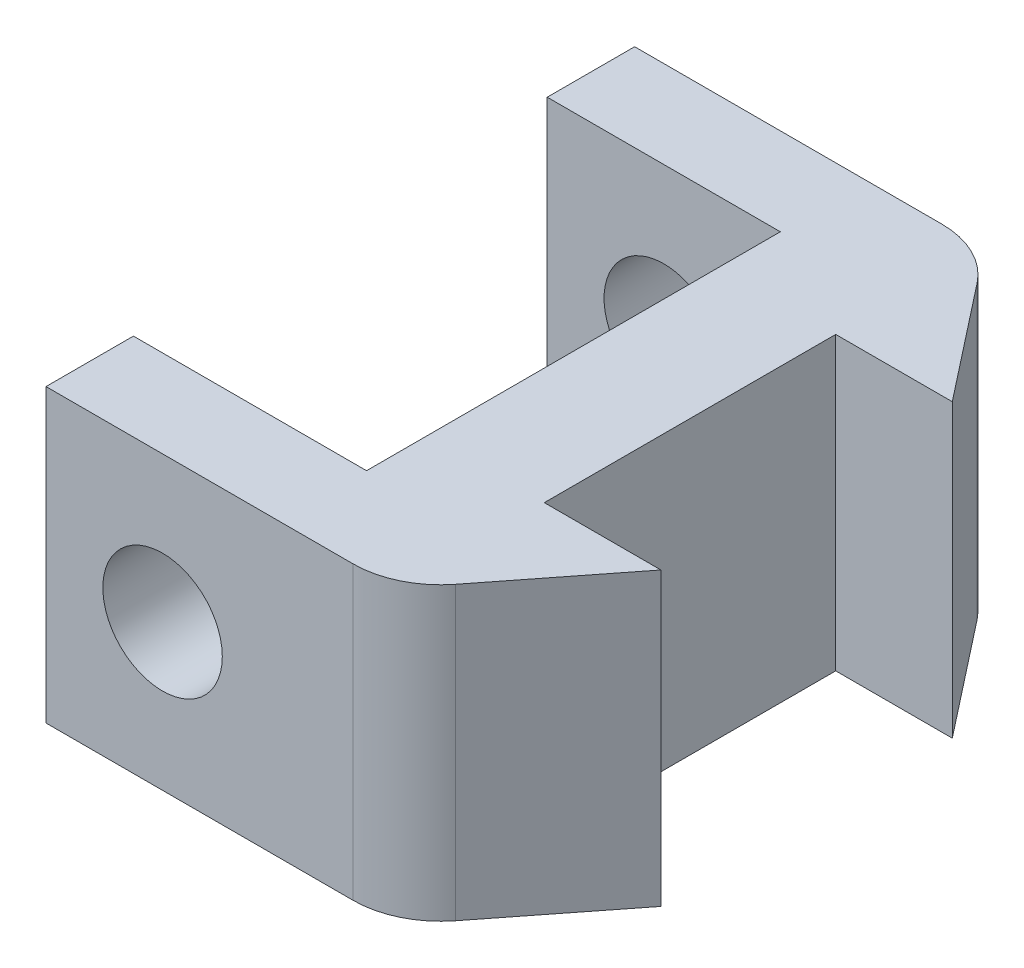
ISO-10303-21;
HEADER;
FILE_DESCRIPTION(('STEP AP214'),'2;1');
FILE_NAME('part.step','',(''),(''),'','','');
FILE_SCHEMA(('AUTOMOTIVE_DESIGN { 1 0 10303 214 1 1 1 1 }'));
ENDSEC;
DATA;
#1=APPLICATION_CONTEXT('core data for automotive mechanical design processes');
#2=APPLICATION_PROTOCOL_DEFINITION('international standard','automotive_design',2000,#1);
#3=PRODUCT_CONTEXT('',#1,'mechanical');
#4=PRODUCT('Part','Part','',(#3));
#5=PRODUCT_RELATED_PRODUCT_CATEGORY('part','',(#4));
#6=PRODUCT_DEFINITION_FORMATION('','',#4);
#7=PRODUCT_DEFINITION_CONTEXT('part definition',#1,'design');
#8=PRODUCT_DEFINITION('design','',#6,#7);
#9=PRODUCT_DEFINITION_SHAPE('','',#8);
#10=(LENGTH_UNIT() NAMED_UNIT(*) SI_UNIT(.MILLI.,.METRE.));
#11=(NAMED_UNIT(*) PLANE_ANGLE_UNIT() SI_UNIT($,.RADIAN.));
#12=(NAMED_UNIT(*) SI_UNIT($,.STERADIAN.) SOLID_ANGLE_UNIT());
#13=UNCERTAINTY_MEASURE_WITH_UNIT(LENGTH_MEASURE(1.E-05),#10,'distance_accuracy_value','');
#14=(GEOMETRIC_REPRESENTATION_CONTEXT(3) GLOBAL_UNCERTAINTY_ASSIGNED_CONTEXT((#13)) GLOBAL_UNIT_ASSIGNED_CONTEXT((#10,
#11,#12)) REPRESENTATION_CONTEXT('',''));
#15=CARTESIAN_POINT('',(0.,0.,0.));
#16=DIRECTION('',(0.,0.,1.));
#17=DIRECTION('',(1.,0.,0.));
#18=AXIS2_PLACEMENT_3D('',#15,#16,#17);
#19=CARTESIAN_POINT('',(0.,10.,-7.1));
#20=DIRECTION('',(0.,0.,1.));
#21=DIRECTION('',(1.,0.,0.));
#22=AXIS2_PLACEMENT_3D('',#19,#20,#21);
#23=PLANE('',#22);
#24=CARTESIAN_POINT('',(-2.,5.,-7.1));
#25=DIRECTION('',(0.,0.,1.));
#26=DIRECTION('',(1.,0.,0.));
#27=AXIS2_PLACEMENT_3D('',#24,#25,#26);
#28=CIRCLE('',#27,2.05);
#29=CARTESIAN_POINT('',(0.0499999999999997,5.,-7.1));
#30=VERTEX_POINT('',#29);
#31=EDGE_CURVE('E209',#30,#30,#28,.T.);
#32=ORIENTED_EDGE('',*,*,#31,.F.);
#33=EDGE_LOOP('',(#32));
#34=FACE_BOUND('',#33,.T.);
#35=DIRECTION('',(-1.,0.,0.));
#36=VECTOR('',#35,1.);
#37=CARTESIAN_POINT('',(0.,0.,-7.1));
#38=LINE('',#37,#36);
#39=CARTESIAN_POINT('',(2.,0.,-7.1));
#40=VERTEX_POINT('',#39);
#41=CARTESIAN_POINT('',(-6.,0.,-7.1));
#42=VERTEX_POINT('',#41);
#43=EDGE_CURVE('E213',#40,#42,#38,.T.);
#44=ORIENTED_EDGE('',*,*,#43,.F.);
#45=DIRECTION('',(0.,-1.,0.));
#46=VECTOR('',#45,1.);
#47=CARTESIAN_POINT('',(2.,10.,-7.1));
#48=LINE('',#47,#46);
#49=CARTESIAN_POINT('',(2.,10.,-7.1));
#50=VERTEX_POINT('',#49);
#51=EDGE_CURVE('E281',#50,#40,#48,.T.);
#52=ORIENTED_EDGE('',*,*,#51,.F.);
#53=DIRECTION('',(-1.,0.,0.));
#54=VECTOR('',#53,1.);
#55=CARTESIAN_POINT('',(0.,10.,-7.1));
#56=LINE('',#55,#54);
#57=CARTESIAN_POINT('',(-6.,10.,-7.1));
#58=VERTEX_POINT('',#57);
#59=EDGE_CURVE('E214',#50,#58,#56,.T.);
#60=ORIENTED_EDGE('',*,*,#59,.T.);
#61=DIRECTION('',(0.,-1.,0.));
#62=VECTOR('',#61,1.);
#63=CARTESIAN_POINT('',(-6.,10.,-7.1));
#64=LINE('',#63,#62);
#65=EDGE_CURVE('E264',#58,#42,#64,.T.);
#66=ORIENTED_EDGE('',*,*,#65,.T.);
#67=EDGE_LOOP('',(#44,#52,#60,#66));
#68=FACE_BOUND('',#67,.T.);
#69=ADVANCED_FACE('F41',(#34,#68),#23,.T.);
#70=CARTESIAN_POINT('',(2.,10.,0.));
#71=DIRECTION('',(-1.,0.,0.));
#72=DIRECTION('',(0.,0.,1.));
#73=AXIS2_PLACEMENT_3D('',#70,#71,#72);
#74=PLANE('',#73);
#75=DIRECTION('',(0.,0.,-1.));
#76=VECTOR('',#75,1.);
#77=CARTESIAN_POINT('',(2.,0.,0.));
#78=LINE('',#77,#76);
#79=CARTESIAN_POINT('',(2.,0.,7.1));
#80=VERTEX_POINT('',#79);
#81=EDGE_CURVE('E243',#80,#40,#78,.T.);
#82=ORIENTED_EDGE('',*,*,#81,.F.);
#83=DIRECTION('',(0.,-1.,0.));
#84=VECTOR('',#83,1.);
#85=CARTESIAN_POINT('',(2.,10.,7.1));
#86=LINE('',#85,#84);
#87=CARTESIAN_POINT('',(2.,10.,7.1));
#88=VERTEX_POINT('',#87);
#89=EDGE_CURVE('E278',#88,#80,#86,.T.);
#90=ORIENTED_EDGE('',*,*,#89,.F.);
#91=DIRECTION('',(0.,0.,-1.));
#92=VECTOR('',#91,1.);
#93=CARTESIAN_POINT('',(2.,10.,0.));
#94=LINE('',#93,#92);
#95=EDGE_CURVE('E218',#88,#50,#94,.T.);
#96=ORIENTED_EDGE('',*,*,#95,.T.);
#97=ORIENTED_EDGE('',*,*,#51,.T.);
#98=EDGE_LOOP('',(#82,#90,#96,#97));
#99=FACE_BOUND('',#98,.T.);
#100=ADVANCED_FACE('F328',(#99),#74,.T.);
#101=CARTESIAN_POINT('',(0.,10.,7.1));
#102=DIRECTION('',(0.,0.,1.));
#103=DIRECTION('',(1.,0.,0.));
#104=AXIS2_PLACEMENT_3D('',#101,#102,#103);
#105=PLANE('',#104);
#106=CARTESIAN_POINT('',(-2.,5.,7.1));
#107=DIRECTION('',(0.,0.,1.));
#108=DIRECTION('',(1.,0.,0.));
#109=AXIS2_PLACEMENT_3D('',#106,#107,#108);
#110=CIRCLE('',#109,2.05);
#111=CARTESIAN_POINT('',(0.0499999999999997,5.,7.1));
#112=VERTEX_POINT('',#111);
#113=EDGE_CURVE('E205',#112,#112,#110,.T.);
#114=ORIENTED_EDGE('',*,*,#113,.T.);
#115=EDGE_LOOP('',(#114));
#116=FACE_BOUND('',#115,.T.);
#117=DIRECTION('',(-1.,0.,0.));
#118=VECTOR('',#117,1.);
#119=CARTESIAN_POINT('',(0.,0.,7.1));
#120=LINE('',#119,#118);
#121=CARTESIAN_POINT('',(-6.,0.,7.1));
#122=VERTEX_POINT('',#121);
#123=EDGE_CURVE('E247',#80,#122,#120,.T.);
#124=ORIENTED_EDGE('',*,*,#123,.T.);
#125=DIRECTION('',(0.,-1.,0.));
#126=VECTOR('',#125,1.);
#127=CARTESIAN_POINT('',(-6.,10.,7.1));
#128=LINE('',#127,#126);
#129=CARTESIAN_POINT('',(-6.,10.,7.1));
#130=VERTEX_POINT('',#129);
#131=EDGE_CURVE('E275',#130,#122,#128,.T.);
#132=ORIENTED_EDGE('',*,*,#131,.F.);
#133=DIRECTION('',(-1.,0.,0.));
#134=VECTOR('',#133,1.);
#135=CARTESIAN_POINT('',(0.,10.,7.1));
#136=LINE('',#135,#134);
#137=EDGE_CURVE('E223',#88,#130,#136,.T.);
#138=ORIENTED_EDGE('',*,*,#137,.F.);
#139=ORIENTED_EDGE('',*,*,#89,.T.);
#140=EDGE_LOOP('',(#124,#132,#138,#139));
#141=FACE_BOUND('',#140,.T.);
#142=ADVANCED_FACE('F333',(#116,#141),#105,.F.);
#143=CARTESIAN_POINT('',(-6.,10.,0.));
#144=DIRECTION('',(-1.,0.,0.));
#145=DIRECTION('',(0.,0.,1.));
#146=AXIS2_PLACEMENT_3D('',#143,#144,#145);
#147=PLANE('',#146);
#148=DIRECTION('',(0.,0.,-1.));
#149=VECTOR('',#148,1.);
#150=CARTESIAN_POINT('',(-6.,0.,0.));
#151=LINE('',#150,#149);
#152=CARTESIAN_POINT('',(-6.,0.,10.1));
#153=VERTEX_POINT('',#152);
#154=EDGE_CURVE('E251',#153,#122,#151,.T.);
#155=ORIENTED_EDGE('',*,*,#154,.F.);
#156=DIRECTION('',(0.,-1.,0.));
#157=VECTOR('',#156,1.);
#158=CARTESIAN_POINT('',(-6.,10.,10.1));
#159=LINE('',#158,#157);
#160=CARTESIAN_POINT('',(-6.,10.,10.1));
#161=VERTEX_POINT('',#160);
#162=EDGE_CURVE('E271',#161,#153,#159,.T.);
#163=ORIENTED_EDGE('',*,*,#162,.F.);
#164=DIRECTION('',(0.,0.,-1.));
#165=VECTOR('',#164,1.);
#166=CARTESIAN_POINT('',(-6.,10.,0.));
#167=LINE('',#166,#165);
#168=EDGE_CURVE('E226',#161,#130,#167,.T.);
#169=ORIENTED_EDGE('',*,*,#168,.T.);
#170=ORIENTED_EDGE('',*,*,#131,.T.);
#171=EDGE_LOOP('',(#155,#163,#169,#170));
#172=FACE_BOUND('',#171,.T.);
#173=ADVANCED_FACE('F337',(#172),#147,.T.);
#174=CARTESIAN_POINT('',(0.,10.,10.1));
#175=DIRECTION('',(0.,0.,1.));
#176=DIRECTION('',(1.,0.,0.));
#177=AXIS2_PLACEMENT_3D('',#174,#175,#176);
#178=PLANE('',#177);
#179=CARTESIAN_POINT('',(-2.,5.,10.1));
#180=DIRECTION('',(0.,0.,1.));
#181=DIRECTION('',(1.,0.,0.));
#182=AXIS2_PLACEMENT_3D('',#179,#180,#181);
#183=CIRCLE('',#182,2.05);
#184=CARTESIAN_POINT('',(0.0499999999999997,5.,10.1));
#185=VERTEX_POINT('',#184);
#186=EDGE_CURVE('E179',#185,#185,#183,.T.);
#187=ORIENTED_EDGE('',*,*,#186,.F.);
#188=EDGE_LOOP('',(#187));
#189=FACE_BOUND('',#188,.T.);
#190=DIRECTION('',(-1.,0.,0.));
#191=VECTOR('',#190,1.);
#192=CARTESIAN_POINT('',(0.,0.,10.1));
#193=LINE('',#192,#191);
#194=CARTESIAN_POINT('',(4.54028695927087,0.,10.1));
#195=VERTEX_POINT('',#194);
#196=EDGE_CURVE('E255',#195,#153,#193,.T.);
#197=ORIENTED_EDGE('',*,*,#196,.F.);
#198=DIRECTION('',(0.,-1.,0.));
#199=VECTOR('',#198,1.);
#200=CARTESIAN_POINT('',(4.54028695927087,9.99999999999999,10.1));
#201=LINE('',#200,#199);
#202=CARTESIAN_POINT('',(4.54028695927087,10.,10.1));
#203=VERTEX_POINT('',#202);
#204=EDGE_CURVE('E11',#195,#203,#201,.F.);
#205=ORIENTED_EDGE('',*,*,#204,.T.);
#206=DIRECTION('',(-1.,0.,0.));
#207=VECTOR('',#206,1.);
#208=CARTESIAN_POINT('',(0.,10.,10.1));
#209=LINE('',#208,#207);
#210=EDGE_CURVE('E230',#203,#161,#209,.T.);
#211=ORIENTED_EDGE('',*,*,#210,.T.);
#212=ORIENTED_EDGE('',*,*,#162,.T.);
#213=EDGE_LOOP('',(#197,#205,#211,#212));
#214=FACE_BOUND('',#213,.T.);
#215=ADVANCED_FACE('F338',(#189,#214),#178,.T.);
#216=CARTESIAN_POINT('',(6.,10.,0.));
#217=DIRECTION('',(-1.,0.,0.));
#218=DIRECTION('',(0.,0.,1.));
#219=AXIS2_PLACEMENT_3D('',#216,#217,#218);
#220=PLANE('',#219);
#221=DIRECTION('',(0.,0.,-1.));
#222=VECTOR('',#221,1.);
#223=CARTESIAN_POINT('',(6.,10.,0.));
#224=LINE('',#223,#222);
#225=CARTESIAN_POINT('',(6.,10.,5.));
#226=VERTEX_POINT('',#225);
#227=CARTESIAN_POINT('',(6.,10.,-5.));
#228=VERTEX_POINT('',#227);
#229=EDGE_CURVE('E234',#226,#228,#224,.T.);
#230=ORIENTED_EDGE('',*,*,#229,.F.);
#231=DIRECTION('',(0.,1.,0.));
#232=VECTOR('',#231,1.);
#233=CARTESIAN_POINT('',(6.,-6.48151216923952,5.));
#234=LINE('',#233,#232);
#235=CARTESIAN_POINT('',(6.,0.,5.));
#236=VERTEX_POINT('',#235);
#237=EDGE_CURVE('E154',#236,#226,#234,.T.);
#238=ORIENTED_EDGE('',*,*,#237,.F.);
#239=DIRECTION('',(0.,0.,-1.));
#240=VECTOR('',#239,1.);
#241=CARTESIAN_POINT('',(6.,0.,0.));
#242=LINE('',#241,#240);
#243=CARTESIAN_POINT('',(6.,0.,-5.));
#244=VERTEX_POINT('',#243);
#245=EDGE_CURVE('E258',#236,#244,#242,.T.);
#246=ORIENTED_EDGE('',*,*,#245,.T.);
#247=DIRECTION('',(0.,1.,0.));
#248=VECTOR('',#247,1.);
#249=CARTESIAN_POINT('',(6.,-6.48151216923952,-5.));
#250=LINE('',#249,#248);
#251=EDGE_CURVE('E188',#244,#228,#250,.T.);
#252=ORIENTED_EDGE('',*,*,#251,.T.);
#253=EDGE_LOOP('',(#230,#238,#246,#252));
#254=FACE_BOUND('',#253,.T.);
#255=ADVANCED_FACE('F359',(#254),#220,.F.);
#256=CARTESIAN_POINT('',(0.,10.,-10.1));
#257=DIRECTION('',(0.,0.,1.));
#258=DIRECTION('',(1.,0.,0.));
#259=AXIS2_PLACEMENT_3D('',#256,#257,#258);
#260=PLANE('',#259);
#261=CARTESIAN_POINT('',(-2.,5.,-10.1));
#262=DIRECTION('',(0.,0.,1.));
#263=DIRECTION('',(1.,0.,0.));
#264=AXIS2_PLACEMENT_3D('',#261,#262,#263);
#265=CIRCLE('',#264,2.05);
#266=CARTESIAN_POINT('',(0.0499999999999997,5.,-10.1));
#267=VERTEX_POINT('',#266);
#268=EDGE_CURVE('E201',#267,#267,#265,.T.);
#269=ORIENTED_EDGE('',*,*,#268,.T.);
#270=EDGE_LOOP('',(#269));
#271=FACE_BOUND('',#270,.T.);
#272=DIRECTION('',(-1.,0.,0.));
#273=VECTOR('',#272,1.);
#274=CARTESIAN_POINT('',(0.,10.,-10.1));
#275=LINE('',#274,#273);
#276=CARTESIAN_POINT('',(4.54028695927087,10.,-10.1));
#277=VERTEX_POINT('',#276);
#278=CARTESIAN_POINT('',(-6.,10.,-10.1));
#279=VERTEX_POINT('',#278);
#280=EDGE_CURVE('E237',#277,#279,#275,.T.);
#281=ORIENTED_EDGE('',*,*,#280,.F.);
#282=DIRECTION('',(0.,-1.,0.));
#283=VECTOR('',#282,1.);
#284=CARTESIAN_POINT('',(4.54028695927087,10.,-10.1));
#285=LINE('',#284,#283);
#286=CARTESIAN_POINT('',(4.54028695927087,0.,-10.1));
#287=VERTEX_POINT('',#286);
#288=EDGE_CURVE('E284',#277,#287,#285,.T.);
#289=ORIENTED_EDGE('',*,*,#288,.T.);
#290=DIRECTION('',(-1.,0.,0.));
#291=VECTOR('',#290,1.);
#292=CARTESIAN_POINT('',(0.,0.,-10.1));
#293=LINE('',#292,#291);
#294=CARTESIAN_POINT('',(-6.,0.,-10.1));
#295=VERTEX_POINT('',#294);
#296=EDGE_CURVE('E261',#287,#295,#293,.T.);
#297=ORIENTED_EDGE('',*,*,#296,.T.);
#298=DIRECTION('',(0.,-1.,0.));
#299=VECTOR('',#298,1.);
#300=CARTESIAN_POINT('',(-6.,10.,-10.1));
#301=LINE('',#300,#299);
#302=EDGE_CURVE('E267',#279,#295,#301,.T.);
#303=ORIENTED_EDGE('',*,*,#302,.F.);
#304=EDGE_LOOP('',(#281,#289,#297,#303));
#305=FACE_BOUND('',#304,.T.);
#306=ADVANCED_FACE('F322',(#271,#305),#260,.F.);
#307=EDGE_CURVE('E219',#42,#295,#151,.T.);
#308=ORIENTED_EDGE('',*,*,#307,.F.);
#309=ORIENTED_EDGE('',*,*,#65,.F.);
#310=EDGE_CURVE('E231',#58,#279,#167,.T.);
#311=ORIENTED_EDGE('',*,*,#310,.T.);
#312=ORIENTED_EDGE('',*,*,#302,.T.);
#313=EDGE_LOOP('',(#308,#309,#311,#312));
#314=FACE_BOUND('',#313,.T.);
#315=ADVANCED_FACE('F314',(#314),#147,.T.);
#316=CARTESIAN_POINT('',(0.,10.,0.));
#317=DIRECTION('',(0.,1.,0.));
#318=DIRECTION('',(0.,0.,1.));
#319=AXIS2_PLACEMENT_3D('',#316,#317,#318);
#320=PLANE('',#319);
#321=DIRECTION('',(0.617139935181102,0.,0.786853417355905));
#322=VECTOR('',#321,1.);
#323=CARTESIAN_POINT('',(8.61937633896691,10.,-6.76029516781719));
#324=LINE('',#323,#322);
#325=CARTESIAN_POINT('',(6.90084721133859,10.,-8.9514198055433));
#326=VERTEX_POINT('',#325);
#327=CARTESIAN_POINT('',(10.,10.,-5.));
#328=VERTEX_POINT('',#327);
#329=EDGE_CURVE('E184',#326,#328,#324,.T.);
#330=ORIENTED_EDGE('',*,*,#329,.F.);
#331=CARTESIAN_POINT('',(4.54028695927087,10.,-7.1));
#332=DIRECTION('',(0.,1.,0.));
#333=DIRECTION('',(0.,0.,1.));
#334=AXIS2_PLACEMENT_3D('',#331,#332,#333);
#335=CIRCLE('',#334,3.);
#336=EDGE_CURVE('E299',#326,#277,#335,.T.);
#337=ORIENTED_EDGE('',*,*,#336,.T.);
#338=ORIENTED_EDGE('',*,*,#280,.T.);
#339=ORIENTED_EDGE('',*,*,#310,.F.);
#340=ORIENTED_EDGE('',*,*,#59,.F.);
#341=ORIENTED_EDGE('',*,*,#95,.F.);
#342=ORIENTED_EDGE('',*,*,#137,.T.);
#343=ORIENTED_EDGE('',*,*,#168,.F.);
#344=ORIENTED_EDGE('',*,*,#210,.F.);
#345=CARTESIAN_POINT('',(4.54028695927087,10.,7.1));
#346=DIRECTION('',(0.,1.,0.));
#347=DIRECTION('',(0.,0.,1.));
#348=AXIS2_PLACEMENT_3D('',#345,#346,#347);
#349=CIRCLE('',#348,3.);
#350=CARTESIAN_POINT('',(6.90084721133859,10.,8.95141980554331));
#351=VERTEX_POINT('',#350);
#352=EDGE_CURVE('E57',#203,#351,#349,.T.);
#353=ORIENTED_EDGE('',*,*,#352,.T.);
#354=DIRECTION('',(-0.617139935181102,0.,0.786853417355905));
#355=VECTOR('',#354,1.);
#356=CARTESIAN_POINT('',(8.61937633896691,10.,6.76029516781719));
#357=LINE('',#356,#355);
#358=CARTESIAN_POINT('',(10.,10.,5.));
#359=VERTEX_POINT('',#358);
#360=EDGE_CURVE('E145',#359,#351,#357,.T.);
#361=ORIENTED_EDGE('',*,*,#360,.F.);
#362=DIRECTION('',(-1.,0.,0.));
#363=VECTOR('',#362,1.);
#364=CARTESIAN_POINT('',(0.,10.,5.));
#365=LINE('',#364,#363);
#366=EDGE_CURVE('E155',#359,#226,#365,.T.);
#367=ORIENTED_EDGE('',*,*,#366,.T.);
#368=ORIENTED_EDGE('',*,*,#229,.T.);
#369=DIRECTION('',(-1.,0.,0.));
#370=VECTOR('',#369,1.);
#371=CARTESIAN_POINT('',(0.,10.,-5.));
#372=LINE('',#371,#370);
#373=EDGE_CURVE('E174',#328,#228,#372,.T.);
#374=ORIENTED_EDGE('',*,*,#373,.F.);
#375=EDGE_LOOP('',(#330,#337,#338,#339,#340,#341,#342,#343,#344,#353,#361,#367,#368,#374));
#376=FACE_BOUND('',#375,.T.);
#377=ADVANCED_FACE('F159',(#376),#320,.T.);
#378=CARTESIAN_POINT('',(0.,0.,0.));
#379=DIRECTION('',(0.,1.,0.));
#380=DIRECTION('',(0.,0.,1.));
#381=AXIS2_PLACEMENT_3D('',#378,#379,#380);
#382=PLANE('',#381);
#383=ORIENTED_EDGE('',*,*,#296,.F.);
#384=CARTESIAN_POINT('',(4.54028695927087,0.,-7.1));
#385=DIRECTION('',(0.,1.,0.));
#386=DIRECTION('',(0.,0.,1.));
#387=AXIS2_PLACEMENT_3D('',#384,#385,#386);
#388=CIRCLE('',#387,3.);
#389=CARTESIAN_POINT('',(6.90084721133859,0.,-8.9514198055433));
#390=VERTEX_POINT('',#389);
#391=EDGE_CURVE('E291',#287,#390,#388,.F.);
#392=ORIENTED_EDGE('',*,*,#391,.T.);
#393=DIRECTION('',(-0.617139935181102,0.,-0.786853417355905));
#394=VECTOR('',#393,1.);
#395=CARTESIAN_POINT('',(8.61937633896691,0.,-6.76029516781719));
#396=LINE('',#395,#394);
#397=CARTESIAN_POINT('',(10.,0.,-5.));
#398=VERTEX_POINT('',#397);
#399=EDGE_CURVE('E180',#398,#390,#396,.T.);
#400=ORIENTED_EDGE('',*,*,#399,.F.);
#401=DIRECTION('',(1.,0.,0.));
#402=VECTOR('',#401,1.);
#403=CARTESIAN_POINT('',(0.,0.,-5.));
#404=LINE('',#403,#402);
#405=EDGE_CURVE('E175',#244,#398,#404,.T.);
#406=ORIENTED_EDGE('',*,*,#405,.F.);
#407=ORIENTED_EDGE('',*,*,#245,.F.);
#408=DIRECTION('',(1.,0.,0.));
#409=VECTOR('',#408,1.);
#410=CARTESIAN_POINT('',(0.,0.,5.));
#411=LINE('',#410,#409);
#412=CARTESIAN_POINT('',(10.,0.,5.));
#413=VERTEX_POINT('',#412);
#414=EDGE_CURVE('E171',#236,#413,#411,.T.);
#415=ORIENTED_EDGE('',*,*,#414,.T.);
#416=DIRECTION('',(0.617139935181102,0.,-0.786853417355905));
#417=VECTOR('',#416,1.);
#418=CARTESIAN_POINT('',(8.61937633896691,0.,6.76029516781719));
#419=LINE('',#418,#417);
#420=CARTESIAN_POINT('',(6.90084721133859,0.,8.95141980554331));
#421=VERTEX_POINT('',#420);
#422=EDGE_CURVE('E148',#421,#413,#419,.T.);
#423=ORIENTED_EDGE('',*,*,#422,.F.);
#424=CARTESIAN_POINT('',(4.54028695927087,0.,7.1));
#425=DIRECTION('',(0.,1.,0.));
#426=DIRECTION('',(0.,0.,1.));
#427=AXIS2_PLACEMENT_3D('',#424,#425,#426);
#428=CIRCLE('',#427,3.);
#429=EDGE_CURVE('E288',#421,#195,#428,.F.);
#430=ORIENTED_EDGE('',*,*,#429,.T.);
#431=ORIENTED_EDGE('',*,*,#196,.T.);
#432=ORIENTED_EDGE('',*,*,#154,.T.);
#433=ORIENTED_EDGE('',*,*,#123,.F.);
#434=ORIENTED_EDGE('',*,*,#81,.T.);
#435=ORIENTED_EDGE('',*,*,#43,.T.);
#436=ORIENTED_EDGE('',*,*,#307,.T.);
#437=EDGE_LOOP('',(#383,#392,#400,#406,#407,#415,#423,#430,#431,#432,#433,#434,#435,#436));
#438=FACE_BOUND('',#437,.T.);
#439=ADVANCED_FACE('F305',(#438),#382,.F.);
#440=CARTESIAN_POINT('',(-2.,5.,-10.1));
#441=DIRECTION('',(0.,0.,1.));
#442=DIRECTION('',(1.,0.,0.));
#443=AXIS2_PLACEMENT_3D('',#440,#441,#442);
#444=CYLINDRICAL_SURFACE('',#443,2.05);
#445=ORIENTED_EDGE('',*,*,#31,.T.);
#446=EDGE_LOOP('',(#445));
#447=FACE_BOUND('',#446,.T.);
#448=ORIENTED_EDGE('',*,*,#268,.F.);
#449=EDGE_LOOP('',(#448));
#450=FACE_BOUND('',#449,.T.);
#451=ADVANCED_FACE('F371',(#447,#450),#444,.F.);
#452=ORIENTED_EDGE('',*,*,#186,.T.);
#453=EDGE_LOOP('',(#452));
#454=FACE_BOUND('',#453,.T.);
#455=ORIENTED_EDGE('',*,*,#113,.F.);
#456=EDGE_LOOP('',(#455));
#457=FACE_BOUND('',#456,.T.);
#458=ADVANCED_FACE('F376',(#454,#457),#444,.F.);
#459=CARTESIAN_POINT('',(8.61937633896691,-6.48151216923952,-6.76029516781719));
#460=DIRECTION('',(-0.786853417355905,0.,0.617139935181102));
#461=DIRECTION('',(0.617139935181102,0.,0.786853417355905));
#462=AXIS2_PLACEMENT_3D('',#459,#460,#461);
#463=PLANE('',#462);
#464=ORIENTED_EDGE('',*,*,#399,.T.);
#465=DIRECTION('',(0.,-1.,0.));
#466=VECTOR('',#465,1.);
#467=CARTESIAN_POINT('',(6.90084721133859,-6.48151216923952,-8.9514198055433));
#468=LINE('',#467,#466);
#469=EDGE_CURVE('E294',#390,#326,#468,.F.);
#470=ORIENTED_EDGE('',*,*,#469,.T.);
#471=ORIENTED_EDGE('',*,*,#329,.T.);
#472=DIRECTION('',(0.,1.,0.));
#473=VECTOR('',#472,1.);
#474=CARTESIAN_POINT('',(10.,-6.48151216923952,-5.));
#475=LINE('',#474,#473);
#476=EDGE_CURVE('E187',#398,#328,#475,.T.);
#477=ORIENTED_EDGE('',*,*,#476,.F.);
#478=EDGE_LOOP('',(#464,#470,#471,#477));
#479=FACE_BOUND('',#478,.T.);
#480=ADVANCED_FACE('F381',(#479),#463,.F.);
#481=CARTESIAN_POINT('',(0.,-6.48151216923952,-5.));
#482=DIRECTION('',(0.,0.,-1.));
#483=DIRECTION('',(-1.,0.,0.));
#484=AXIS2_PLACEMENT_3D('',#481,#482,#483);
#485=PLANE('',#484);
#486=ORIENTED_EDGE('',*,*,#251,.F.);
#487=ORIENTED_EDGE('',*,*,#405,.T.);
#488=ORIENTED_EDGE('',*,*,#476,.T.);
#489=ORIENTED_EDGE('',*,*,#373,.T.);
#490=EDGE_LOOP('',(#486,#487,#488,#489));
#491=FACE_BOUND('',#490,.T.);
#492=ADVANCED_FACE('F378',(#491),#485,.F.);
#493=CARTESIAN_POINT('',(8.61937633896691,-6.48151216923952,6.76029516781719));
#494=DIRECTION('',(-0.786853417355905,0.,-0.617139935181102));
#495=DIRECTION('',(-0.617139935181102,0.,0.786853417355905));
#496=AXIS2_PLACEMENT_3D('',#493,#494,#495);
#497=PLANE('',#496);
#498=ORIENTED_EDGE('',*,*,#360,.T.);
#499=DIRECTION('',(0.,-1.,0.));
#500=VECTOR('',#499,1.);
#501=CARTESIAN_POINT('',(6.90084721133859,0.,8.95141980554331));
#502=LINE('',#501,#500);
#503=EDGE_CURVE('E50',#351,#421,#502,.T.);
#504=ORIENTED_EDGE('',*,*,#503,.T.);
#505=ORIENTED_EDGE('',*,*,#422,.T.);
#506=DIRECTION('',(0.,1.,0.));
#507=VECTOR('',#506,1.);
#508=CARTESIAN_POINT('',(10.,-6.48151216923952,5.));
#509=LINE('',#508,#507);
#510=EDGE_CURVE('E142',#413,#359,#509,.T.);
#511=ORIENTED_EDGE('',*,*,#510,.T.);
#512=EDGE_LOOP('',(#498,#504,#505,#511));
#513=FACE_BOUND('',#512,.T.);
#514=ADVANCED_FACE('F143',(#513),#497,.F.);
#515=CARTESIAN_POINT('',(0.,-6.48151216923952,5.));
#516=DIRECTION('',(0.,0.,-1.));
#517=DIRECTION('',(-1.,0.,0.));
#518=AXIS2_PLACEMENT_3D('',#515,#516,#517);
#519=PLANE('',#518);
#520=ORIENTED_EDGE('',*,*,#414,.F.);
#521=ORIENTED_EDGE('',*,*,#237,.T.);
#522=ORIENTED_EDGE('',*,*,#366,.F.);
#523=ORIENTED_EDGE('',*,*,#510,.F.);
#524=EDGE_LOOP('',(#520,#521,#522,#523));
#525=FACE_BOUND('',#524,.T.);
#526=ADVANCED_FACE('F163',(#525),#519,.T.);
#527=CARTESIAN_POINT('',(4.54028695927087,10.,-7.1));
#528=DIRECTION('',(0.,-1.,0.));
#529=DIRECTION('',(0.,0.,-1.));
#530=AXIS2_PLACEMENT_3D('',#527,#528,#529);
#531=CYLINDRICAL_SURFACE('',#530,3.);
#532=ORIENTED_EDGE('',*,*,#336,.F.);
#533=ORIENTED_EDGE('',*,*,#469,.F.);
#534=ORIENTED_EDGE('',*,*,#391,.F.);
#535=ORIENTED_EDGE('',*,*,#288,.F.);
#536=EDGE_LOOP('',(#532,#533,#534,#535));
#537=FACE_BOUND('',#536,.T.);
#538=ADVANCED_FACE('F340',(#537),#531,.T.);
#539=CARTESIAN_POINT('',(4.54028695927087,-6.48151216923952,7.1));
#540=DIRECTION('',(0.,1.,0.));
#541=DIRECTION('',(0.,0.,1.));
#542=AXIS2_PLACEMENT_3D('',#539,#540,#541);
#543=CYLINDRICAL_SURFACE('',#542,3.);
#544=ORIENTED_EDGE('',*,*,#352,.F.);
#545=ORIENTED_EDGE('',*,*,#204,.F.);
#546=ORIENTED_EDGE('',*,*,#429,.F.);
#547=ORIENTED_EDGE('',*,*,#503,.F.);
#548=EDGE_LOOP('',(#544,#545,#546,#547));
#549=FACE_BOUND('',#548,.T.);
#550=ADVANCED_FACE('F43',(#549),#543,.T.);
#551=CLOSED_SHELL('',(#69,#100,#142,#173,#215,#255,#306,#315,#377,#439,#451,#458,#480,#492,#514,
#526,#538,#550));
#552=MANIFOLD_SOLID_BREP('B2',#551);
#553=ADVANCED_BREP_SHAPE_REPRESENTATION('',(#18,#552),#14);
#554=SHAPE_DEFINITION_REPRESENTATION(#9,#553);
ENDSEC;
END-ISO-10303-21;
